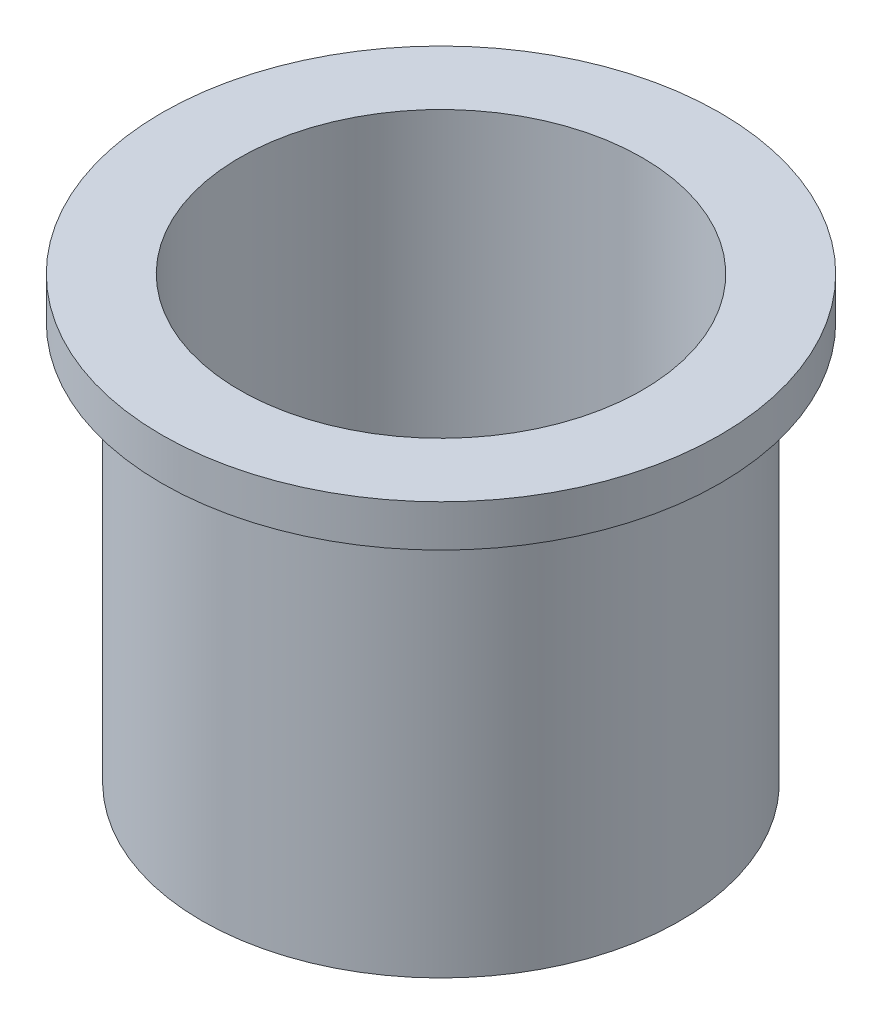
ISO-10303-21;
HEADER;
FILE_DESCRIPTION(('STEP AP214'),'2;1');
FILE_NAME('part.step','',(''),(''),'','','');
FILE_SCHEMA(('AUTOMOTIVE_DESIGN { 1 0 10303 214 1 1 1 1 }'));
ENDSEC;
DATA;
#1=APPLICATION_CONTEXT('core data for automotive mechanical design processes');
#2=APPLICATION_PROTOCOL_DEFINITION('international standard','automotive_design',2000,#1);
#3=PRODUCT_CONTEXT('',#1,'mechanical');
#4=PRODUCT('Part','Part','',(#3));
#5=PRODUCT_RELATED_PRODUCT_CATEGORY('part','',(#4));
#6=PRODUCT_DEFINITION_FORMATION('','',#4);
#7=PRODUCT_DEFINITION_CONTEXT('part definition',#1,'design');
#8=PRODUCT_DEFINITION('design','',#6,#7);
#9=PRODUCT_DEFINITION_SHAPE('','',#8);
#10=(LENGTH_UNIT() NAMED_UNIT(*) SI_UNIT(.MILLI.,.METRE.));
#11=(NAMED_UNIT(*) PLANE_ANGLE_UNIT() SI_UNIT($,.RADIAN.));
#12=(NAMED_UNIT(*) SI_UNIT($,.STERADIAN.) SOLID_ANGLE_UNIT());
#13=UNCERTAINTY_MEASURE_WITH_UNIT(LENGTH_MEASURE(1.E-05),#10,'distance_accuracy_value','');
#14=(GEOMETRIC_REPRESENTATION_CONTEXT(3) GLOBAL_UNCERTAINTY_ASSIGNED_CONTEXT((#13)) GLOBAL_UNIT_ASSIGNED_CONTEXT((#10,
#11,#12)) REPRESENTATION_CONTEXT('',''));
#15=CARTESIAN_POINT('',(0.,0.,0.));
#16=DIRECTION('',(0.,0.,1.));
#17=DIRECTION('',(1.,0.,0.));
#18=AXIS2_PLACEMENT_3D('',#15,#16,#17);
#19=CARTESIAN_POINT('',(-20.2916512459885,-95.98,0.));
#20=DIRECTION('',(0.,-1.,0.));
#21=DIRECTION('',(0.,0.,-1.));
#22=AXIS2_PLACEMENT_3D('',#19,#20,#21);
#23=CYLINDRICAL_SURFACE('',#22,6.);
#24=CARTESIAN_POINT('',(-20.2916512459885,-95.98,0.));
#25=DIRECTION('',(0.,1.,0.));
#26=DIRECTION('',(0.,0.,1.));
#27=AXIS2_PLACEMENT_3D('',#24,#25,#26);
#28=CIRCLE('',#27,6.);
#29=CARTESIAN_POINT('',(-20.2916512459885,-95.98,6.));
#30=VERTEX_POINT('',#29);
#31=EDGE_CURVE('E10',#30,#30,#28,.T.);
#32=ORIENTED_EDGE('',*,*,#31,.F.);
#33=EDGE_LOOP('',(#32));
#34=FACE_BOUND('',#33,.T.);
#35=CARTESIAN_POINT('',(-20.2916512459885,-105.98,0.));
#36=DIRECTION('',(0.,1.,0.));
#37=DIRECTION('',(0.,0.,1.));
#38=AXIS2_PLACEMENT_3D('',#35,#36,#37);
#39=CIRCLE('',#38,6.);
#40=CARTESIAN_POINT('',(-20.2916512459885,-105.98,6.));
#41=VERTEX_POINT('',#40);
#42=EDGE_CURVE('E46',#41,#41,#39,.T.);
#43=ORIENTED_EDGE('',*,*,#42,.T.);
#44=EDGE_LOOP('',(#43));
#45=FACE_BOUND('',#44,.T.);
#46=ADVANCED_FACE('F39',(#34,#45),#23,.T.);
#47=CARTESIAN_POINT('',(-20.2916512459885,-105.98,0.));
#48=DIRECTION('',(0.,1.,0.));
#49=DIRECTION('',(0.,0.,1.));
#50=AXIS2_PLACEMENT_3D('',#47,#48,#49);
#51=PLANE('',#50);
#52=CARTESIAN_POINT('',(-20.2916512459885,-105.98,0.));
#53=DIRECTION('',(0.,1.,0.));
#54=DIRECTION('',(0.,0.,1.));
#55=AXIS2_PLACEMENT_3D('',#52,#53,#54);
#56=CIRCLE('',#55,5.05);
#57=CARTESIAN_POINT('',(-20.2916512459885,-105.98,-5.05));
#58=VERTEX_POINT('',#57);
#59=EDGE_CURVE('E57',#58,#58,#56,.F.);
#60=ORIENTED_EDGE('',*,*,#59,.F.);
#61=EDGE_LOOP('',(#60));
#62=FACE_BOUND('',#61,.T.);
#63=ORIENTED_EDGE('',*,*,#42,.F.);
#64=EDGE_LOOP('',(#63));
#65=FACE_BOUND('',#64,.T.);
#66=ADVANCED_FACE('F78',(#62,#65),#51,.F.);
#67=CARTESIAN_POINT('',(-20.2916512459885,-94.93,0.));
#68=DIRECTION('',(0.,-1.,0.));
#69=DIRECTION('',(0.,0.,-1.));
#70=AXIS2_PLACEMENT_3D('',#67,#68,#69);
#71=CYLINDRICAL_SURFACE('',#70,7.);
#72=CARTESIAN_POINT('',(-20.2916512459885,-94.93,0.));
#73=DIRECTION('',(0.,1.,0.));
#74=DIRECTION('',(0.,0.,1.));
#75=AXIS2_PLACEMENT_3D('',#72,#73,#74);
#76=CIRCLE('',#75,7.);
#77=CARTESIAN_POINT('',(-20.2916512459885,-94.93,7.));
#78=VERTEX_POINT('',#77);
#79=EDGE_CURVE('E51',#78,#78,#76,.T.);
#80=ORIENTED_EDGE('',*,*,#79,.F.);
#81=EDGE_LOOP('',(#80));
#82=FACE_BOUND('',#81,.T.);
#83=CARTESIAN_POINT('',(-20.2916512459885,-95.98,0.));
#84=DIRECTION('',(0.,1.,0.));
#85=DIRECTION('',(0.,0.,1.));
#86=AXIS2_PLACEMENT_3D('',#83,#84,#85);
#87=CIRCLE('',#86,7.);
#88=CARTESIAN_POINT('',(-20.2916512459885,-95.98,7.));
#89=VERTEX_POINT('',#88);
#90=EDGE_CURVE('E52',#89,#89,#87,.T.);
#91=ORIENTED_EDGE('',*,*,#90,.T.);
#92=EDGE_LOOP('',(#91));
#93=FACE_BOUND('',#92,.T.);
#94=ADVANCED_FACE('F81',(#82,#93),#71,.T.);
#95=CARTESIAN_POINT('',(-20.2916512459885,-94.93,0.));
#96=DIRECTION('',(0.,1.,0.));
#97=DIRECTION('',(0.,0.,1.));
#98=AXIS2_PLACEMENT_3D('',#95,#96,#97);
#99=PLANE('',#98);
#100=CARTESIAN_POINT('',(-20.2916512459885,-94.93,0.));
#101=DIRECTION('',(0.,1.,0.));
#102=DIRECTION('',(0.,0.,1.));
#103=AXIS2_PLACEMENT_3D('',#100,#101,#102);
#104=CIRCLE('',#103,5.05);
#105=CARTESIAN_POINT('',(-20.2916512459885,-94.93,-5.05));
#106=VERTEX_POINT('',#105);
#107=EDGE_CURVE('E45',#106,#106,#104,.F.);
#108=ORIENTED_EDGE('',*,*,#107,.T.);
#109=EDGE_LOOP('',(#108));
#110=FACE_BOUND('',#109,.T.);
#111=ORIENTED_EDGE('',*,*,#79,.T.);
#112=EDGE_LOOP('',(#111));
#113=FACE_BOUND('',#112,.T.);
#114=ADVANCED_FACE('F65',(#110,#113),#99,.T.);
#115=CARTESIAN_POINT('',(-20.2916512459885,-95.98,0.));
#116=DIRECTION('',(0.,1.,0.));
#117=DIRECTION('',(0.,0.,1.));
#118=AXIS2_PLACEMENT_3D('',#115,#116,#117);
#119=PLANE('',#118);
#120=ORIENTED_EDGE('',*,*,#31,.T.);
#121=EDGE_LOOP('',(#120));
#122=FACE_BOUND('',#121,.T.);
#123=ORIENTED_EDGE('',*,*,#90,.F.);
#124=EDGE_LOOP('',(#123));
#125=FACE_BOUND('',#124,.T.);
#126=ADVANCED_FACE('F66',(#122,#125),#119,.F.);
#127=CARTESIAN_POINT('',(-20.2916512459885,-94.83,0.));
#128=DIRECTION('',(0.,-1.,0.));
#129=DIRECTION('',(0.,0.,-1.));
#130=AXIS2_PLACEMENT_3D('',#127,#128,#129);
#131=CYLINDRICAL_SURFACE('',#130,5.05);
#132=CARTESIAN_POINT('',(-20.2916512459885,-94.93,-5.05));
#133=CARTESIAN_POINT('',(-20.2916512459885,-95.0451041666667,-5.05));
#134=CARTESIAN_POINT('',(-20.2916512459885,-95.1602083333334,-5.05));
#135=CARTESIAN_POINT('',(-20.2916512459885,-95.3904166666667,-5.05));
#136=CARTESIAN_POINT('',(-20.2916512459885,-95.5055208333333,-5.05));
#137=CARTESIAN_POINT('',(-20.2916512459885,-95.7357291666667,-5.05));
#138=CARTESIAN_POINT('',(-20.2916512459885,-95.8508333333333,-5.05));
#139=CARTESIAN_POINT('',(-20.2916512459885,-96.0810416666667,-5.05));
#140=CARTESIAN_POINT('',(-20.2916512459885,-96.1961458333333,-5.05));
#141=CARTESIAN_POINT('',(-20.2916512459885,-96.4263541666667,-5.05));
#142=CARTESIAN_POINT('',(-20.2916512459885,-96.5414583333333,-5.05));
#143=CARTESIAN_POINT('',(-20.2916512459885,-96.7716666666667,-5.05));
#144=CARTESIAN_POINT('',(-20.2916512459885,-96.8867708333333,-5.05));
#145=CARTESIAN_POINT('',(-20.2916512459885,-97.1169791666667,-5.05));
#146=CARTESIAN_POINT('',(-20.2916512459885,-97.2320833333333,-5.05));
#147=CARTESIAN_POINT('',(-20.2916512459885,-97.4622916666667,-5.05));
#148=CARTESIAN_POINT('',(-20.2916512459885,-97.5773958333333,-5.05));
#149=CARTESIAN_POINT('',(-20.2916512459885,-97.8076041666667,-5.05));
#150=CARTESIAN_POINT('',(-20.2916512459885,-97.9227083333333,-5.05));
#151=CARTESIAN_POINT('',(-20.2916512459885,-98.1529166666667,-5.05));
#152=CARTESIAN_POINT('',(-20.2916512459885,-98.2680208333333,-5.05));
#153=CARTESIAN_POINT('',(-20.2916512459885,-98.4982291666667,-5.05));
#154=CARTESIAN_POINT('',(-20.2916512459885,-98.6133333333333,-5.05));
#155=CARTESIAN_POINT('',(-20.2916512459885,-98.8435416666667,-5.05));
#156=CARTESIAN_POINT('',(-20.2916512459885,-98.9586458333333,-5.05));
#157=CARTESIAN_POINT('',(-20.2916512459885,-99.1888541666667,-5.05));
#158=CARTESIAN_POINT('',(-20.2916512459885,-99.3039583333333,-5.05));
#159=CARTESIAN_POINT('',(-20.2916512459885,-99.5341666666667,-5.05));
#160=CARTESIAN_POINT('',(-20.2916512459885,-99.6492708333333,-5.05));
#161=CARTESIAN_POINT('',(-20.2916512459885,-99.8794791666667,-5.05));
#162=CARTESIAN_POINT('',(-20.2916512459885,-99.9945833333333,-5.05));
#163=CARTESIAN_POINT('',(-20.2916512459885,-100.224791666667,-5.05));
#164=CARTESIAN_POINT('',(-20.2916512459885,-100.339895833333,-5.05));
#165=CARTESIAN_POINT('',(-20.2916512459885,-100.570104166667,-5.05));
#166=CARTESIAN_POINT('',(-20.2916512459885,-100.685208333333,-5.05));
#167=CARTESIAN_POINT('',(-20.2916512459885,-100.915416666667,-5.05));
#168=CARTESIAN_POINT('',(-20.2916512459885,-101.030520833333,-5.05));
#169=CARTESIAN_POINT('',(-20.2916512459885,-101.260729166667,-5.05));
#170=CARTESIAN_POINT('',(-20.2916512459885,-101.375833333333,-5.05));
#171=CARTESIAN_POINT('',(-20.2916512459885,-101.606041666667,-5.05));
#172=CARTESIAN_POINT('',(-20.2916512459885,-101.721145833333,-5.05));
#173=CARTESIAN_POINT('',(-20.2916512459885,-101.951354166667,-5.05));
#174=CARTESIAN_POINT('',(-20.2916512459885,-102.066458333333,-5.05));
#175=CARTESIAN_POINT('',(-20.2916512459885,-102.296666666667,-5.05));
#176=CARTESIAN_POINT('',(-20.2916512459885,-102.411770833333,-5.05));
#177=CARTESIAN_POINT('',(-20.2916512459885,-102.641979166667,-5.05));
#178=CARTESIAN_POINT('',(-20.2916512459885,-102.757083333333,-5.05));
#179=CARTESIAN_POINT('',(-20.2916512459885,-102.987291666667,-5.05));
#180=CARTESIAN_POINT('',(-20.2916512459885,-103.102395833333,-5.05));
#181=CARTESIAN_POINT('',(-20.2916512459885,-103.332604166667,-5.05));
#182=CARTESIAN_POINT('',(-20.2916512459885,-103.447708333333,-5.05));
#183=CARTESIAN_POINT('',(-20.2916512459885,-103.677916666667,-5.05));
#184=CARTESIAN_POINT('',(-20.2916512459885,-103.793020833333,-5.05));
#185=CARTESIAN_POINT('',(-20.2916512459885,-104.023229166667,-5.05));
#186=CARTESIAN_POINT('',(-20.2916512459885,-104.138333333333,-5.05));
#187=CARTESIAN_POINT('',(-20.2916512459885,-104.368541666667,-5.05));
#188=CARTESIAN_POINT('',(-20.2916512459885,-104.483645833333,-5.05));
#189=CARTESIAN_POINT('',(-20.2916512459885,-104.713854166667,-5.05));
#190=CARTESIAN_POINT('',(-20.2916512459885,-104.828958333333,-5.05));
#191=CARTESIAN_POINT('',(-20.2916512459885,-105.059166666667,-5.05));
#192=CARTESIAN_POINT('',(-20.2916512459885,-105.174270833333,-5.05));
#193=CARTESIAN_POINT('',(-20.2916512459885,-105.404479166667,-5.05));
#194=CARTESIAN_POINT('',(-20.2916512459885,-105.519583333333,-5.05));
#195=CARTESIAN_POINT('',(-20.2916512459885,-105.749791666667,-5.05));
#196=CARTESIAN_POINT('',(-20.2916512459885,-105.864895833333,-5.05));
#197=CARTESIAN_POINT('',(-20.2916512459885,-105.98,-5.05));
#198=B_SPLINE_CURVE_WITH_KNOTS('',3,(#132,#133,#134,#135,#136,#137,#138,#139,#140,#141,#142,
#143,#144,#145,#146,#147,#148,#149,#150,#151,#152,#153,#154,#155,#156,#157,#158,#159,#160,#161,
#162,#163,#164,#165,#166,#167,#168,#169,#170,#171,#172,#173,#174,#175,#176,#177,#178,#179,#180,
#181,#182,#183,#184,#185,#186,#187,#188,#189,#190,#191,#192,#193,#194,#195,#196,#197),
.UNSPECIFIED.,.F.,.F.,(4,2,2,2,2,2,2,2,2,2,2,2,2,2,2,2,2,2,2,2,2,2,2,2,2,2,2,2,2,2,2,2,4),(0.,
0.345312499999986,0.690624999999986,1.03593749999999,1.38124999999999,1.72656249999999,
2.07187499999999,2.41718749999999,2.76249999999999,3.10781249999999,3.45312499999999,
3.79843749999999,4.14374999999999,4.48906249999999,4.83437499999999,5.17968749999999,
5.52499999999999,5.87031249999999,6.21562499999999,6.56093749999999,6.90624999999999,
7.25156249999999,7.59687499999999,7.94218749999999,8.28749999999999,8.63281249999999,
8.97812499999999,9.32343749999999,9.66874999999999,10.0140625,10.359375,10.7046875,11.05),.UNSPECIFIED.);
#199=EDGE_CURVE('BSEAM68',#106,#58,#198,.T.);
#200=ORIENTED_EDGE('',*,*,#107,.F.);
#201=ORIENTED_EDGE('',*,*,#59,.T.);
#202=ORIENTED_EDGE('',*,*,#199,.T.);
#203=ORIENTED_EDGE('',*,*,#199,.F.);
#204=EDGE_LOOP('',(#200,#202,#201,#203));
#205=FACE_BOUND('',#204,.T.);
#206=ADVANCED_FACE('F68',(#205),#131,.F.);
#207=CLOSED_SHELL('',(#46,#66,#94,#114,#126,#206));
#208=MANIFOLD_SOLID_BREP('B2',#207);
#209=ADVANCED_BREP_SHAPE_REPRESENTATION('',(#18,#208),#14);
#210=SHAPE_DEFINITION_REPRESENTATION(#9,#209);
ENDSEC;
END-ISO-10303-21;
